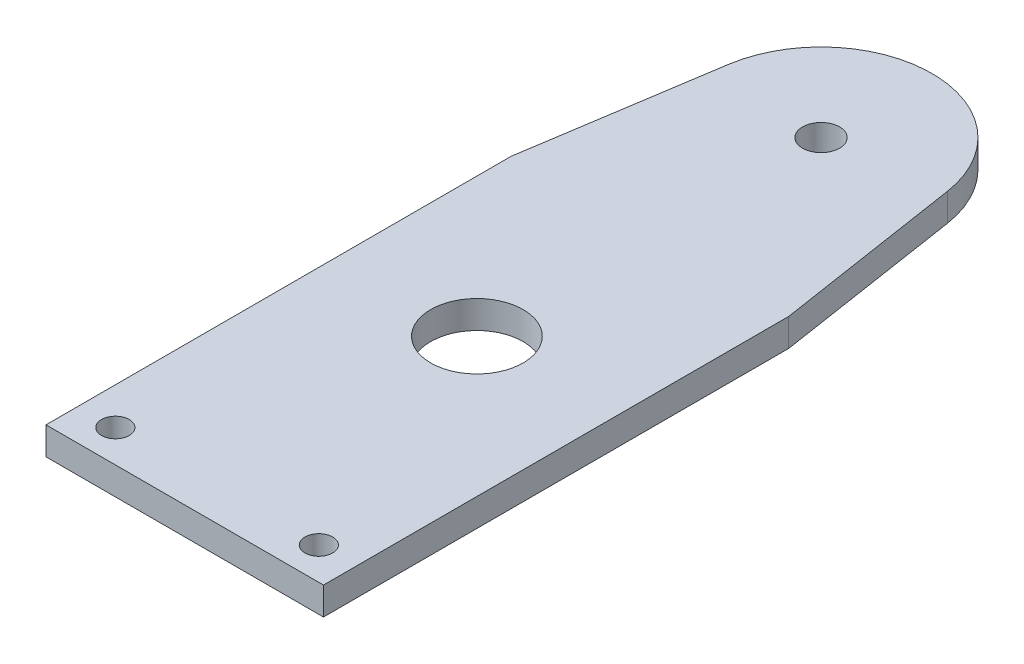
ISO-10303-21;
HEADER;
FILE_DESCRIPTION(('STEP AP214'),'2;1');
FILE_NAME('part.step','',(''),(''),'','','');
FILE_SCHEMA(('AUTOMOTIVE_DESIGN { 1 0 10303 214 1 1 1 1 }'));
ENDSEC;
DATA;
#1=APPLICATION_CONTEXT('core data for automotive mechanical design processes');
#2=APPLICATION_PROTOCOL_DEFINITION('international standard','automotive_design',2000,#1);
#3=PRODUCT_CONTEXT('',#1,'mechanical');
#4=PRODUCT('Part','Part','',(#3));
#5=PRODUCT_RELATED_PRODUCT_CATEGORY('part','',(#4));
#6=PRODUCT_DEFINITION_FORMATION('','',#4);
#7=PRODUCT_DEFINITION_CONTEXT('part definition',#1,'design');
#8=PRODUCT_DEFINITION('design','',#6,#7);
#9=PRODUCT_DEFINITION_SHAPE('','',#8);
#10=(LENGTH_UNIT() NAMED_UNIT(*) SI_UNIT(.MILLI.,.METRE.));
#11=(NAMED_UNIT(*) PLANE_ANGLE_UNIT() SI_UNIT($,.RADIAN.));
#12=(NAMED_UNIT(*) SI_UNIT($,.STERADIAN.) SOLID_ANGLE_UNIT());
#13=UNCERTAINTY_MEASURE_WITH_UNIT(LENGTH_MEASURE(1.E-05),#10,'distance_accuracy_value','');
#14=(GEOMETRIC_REPRESENTATION_CONTEXT(3) GLOBAL_UNCERTAINTY_ASSIGNED_CONTEXT((#13)) GLOBAL_UNIT_ASSIGNED_CONTEXT((#10,
#11,#12)) REPRESENTATION_CONTEXT('',''));
#15=CARTESIAN_POINT('',(0.,0.,0.));
#16=DIRECTION('',(0.,0.,1.));
#17=DIRECTION('',(1.,0.,0.));
#18=AXIS2_PLACEMENT_3D('',#15,#16,#17);
#19=CARTESIAN_POINT('',(-2.62522791540278,3.,-39.1827211912994));
#20=DIRECTION('',(0.,1.,0.));
#21=DIRECTION('',(0.,0.,1.));
#22=AXIS2_PLACEMENT_3D('',#19,#20,#21);
#23=PLANE('',#22);
#24=CARTESIAN_POINT('',(-2.62522791540278,3.,-39.1827211912994));
#25=DIRECTION('',(0.,1.,0.));
#26=DIRECTION('',(0.,0.,1.));
#27=AXIS2_PLACEMENT_3D('',#24,#25,#26);
#28=CIRCLE('',#27,2.);
#29=CARTESIAN_POINT('',(-2.62522791540278,3.,-37.1827211912994));
#30=VERTEX_POINT('',#29);
#31=EDGE_CURVE('E188',#30,#30,#28,.T.);
#32=ORIENTED_EDGE('',*,*,#31,.F.);
#33=EDGE_LOOP('',(#32));
#34=FACE_BOUND('',#33,.T.);
#35=CARTESIAN_POINT('',(-13.6252279154028,3.,26.1172788087006));
#36=DIRECTION('',(0.,1.,0.));
#37=DIRECTION('',(0.,0.,1.));
#38=AXIS2_PLACEMENT_3D('',#35,#36,#37);
#39=CIRCLE('',#38,1.5);
#40=CARTESIAN_POINT('',(-13.6252279154028,3.,27.6172788087006));
#41=VERTEX_POINT('',#40);
#42=EDGE_CURVE('E121',#41,#41,#39,.T.);
#43=ORIENTED_EDGE('',*,*,#42,.F.);
#44=EDGE_LOOP('',(#43));
#45=FACE_BOUND('',#44,.T.);
#46=DIRECTION('',(0.,0.,1.));
#47=VECTOR('',#46,1.);
#48=CARTESIAN_POINT('',(-17.6252279154028,3.,29.6172788087006));
#49=LINE('',#48,#47);
#50=CARTESIAN_POINT('',(-17.6252279154028,3.,-20.6827211912994));
#51=VERTEX_POINT('',#50);
#52=CARTESIAN_POINT('',(-17.6252279154028,3.,29.6172788087006));
#53=VERTEX_POINT('',#52);
#54=EDGE_CURVE('E128',#51,#53,#49,.T.);
#55=ORIENTED_EDGE('',*,*,#54,.T.);
#56=DIRECTION('',(1.,0.,0.));
#57=VECTOR('',#56,1.);
#58=CARTESIAN_POINT('',(-10.6252279154028,3.,29.6172788087006));
#59=LINE('',#58,#57);
#60=CARTESIAN_POINT('',(12.3747720845972,3.,29.6172788087006));
#61=VERTEX_POINT('',#60);
#62=EDGE_CURVE('E86',#53,#61,#59,.T.);
#63=ORIENTED_EDGE('',*,*,#62,.T.);
#64=DIRECTION('',(0.,0.,-1.));
#65=VECTOR('',#64,1.);
#66=CARTESIAN_POINT('',(12.3747720845972,3.,29.6172788087006));
#67=LINE('',#66,#65);
#68=CARTESIAN_POINT('',(12.3747720845972,3.,-20.6827211912994));
#69=VERTEX_POINT('',#68);
#70=EDGE_CURVE('E99',#61,#69,#67,.T.);
#71=ORIENTED_EDGE('',*,*,#70,.T.);
#72=DIRECTION('',(-0.152658632299012,0.,-0.988278979835449));
#73=VECTOR('',#72,1.);
#74=CARTESIAN_POINT('',(12.3747720845972,3.,-20.6827211912994));
#75=LINE('',#74,#73);
#76=CARTESIAN_POINT('',(9.23411984262261,3.,-41.0146247788876));
#77=VERTEX_POINT('',#76);
#78=EDGE_CURVE('E93',#69,#77,#75,.T.);
#79=ORIENTED_EDGE('',*,*,#78,.T.);
#80=CARTESIAN_POINT('',(-2.62522791540278,3.,-39.1827211912994));
#81=DIRECTION('',(0.,1.,0.));
#82=DIRECTION('',(0.,0.,1.));
#83=AXIS2_PLACEMENT_3D('',#80,#81,#82);
#84=CIRCLE('',#83,12.);
#85=CARTESIAN_POINT('',(-14.4845756734282,3.,-41.0146247788876));
#86=VERTEX_POINT('',#85);
#87=EDGE_CURVE('E97',#77,#86,#84,.T.);
#88=ORIENTED_EDGE('',*,*,#87,.T.);
#89=DIRECTION('',(-0.152658632299012,0.,0.988278979835449));
#90=VECTOR('',#89,1.);
#91=CARTESIAN_POINT('',(-17.6252279154028,3.,-20.6827211912994));
#92=LINE('',#91,#90);
#93=EDGE_CURVE('E49',#86,#51,#92,.T.);
#94=ORIENTED_EDGE('',*,*,#93,.T.);
#95=EDGE_LOOP('',(#55,#63,#71,#79,#88,#94));
#96=FACE_BOUND('',#95,.T.);
#97=CARTESIAN_POINT('',(8.37477208459722,3.,26.1172788087006));
#98=DIRECTION('',(0.,1.,0.));
#99=DIRECTION('',(0.,0.,1.));
#100=AXIS2_PLACEMENT_3D('',#97,#98,#99);
#101=CIRCLE('',#100,1.5);
#102=CARTESIAN_POINT('',(8.37477208459722,3.,27.6172788087006));
#103=VERTEX_POINT('',#102);
#104=EDGE_CURVE('E194',#103,#103,#101,.T.);
#105=ORIENTED_EDGE('',*,*,#104,.F.);
#106=EDGE_LOOP('',(#105));
#107=FACE_BOUND('',#106,.T.);
#108=CARTESIAN_POINT('',(-2.62522791540278,3.,-1.97272119129942));
#109=DIRECTION('',(0.,1.,0.));
#110=DIRECTION('',(0.,0.,1.));
#111=AXIS2_PLACEMENT_3D('',#108,#109,#110);
#112=CIRCLE('',#111,5.);
#113=CARTESIAN_POINT('',(-2.62522791540278,3.,3.02727880870058));
#114=VERTEX_POINT('',#113);
#115=EDGE_CURVE('E179',#114,#114,#112,.T.);
#116=ORIENTED_EDGE('',*,*,#115,.F.);
#117=EDGE_LOOP('',(#116));
#118=FACE_BOUND('',#117,.T.);
#119=ADVANCED_FACE('F32',(#34,#45,#96,#107,#118),#23,.T.);
#120=CARTESIAN_POINT('',(-2.62522791540278,0.,-39.1827211912994));
#121=DIRECTION('',(0.,1.,0.));
#122=DIRECTION('',(0.,0.,1.));
#123=AXIS2_PLACEMENT_3D('',#120,#121,#122);
#124=PLANE('',#123);
#125=DIRECTION('',(0.,0.,1.));
#126=VECTOR('',#125,1.);
#127=CARTESIAN_POINT('',(-17.6252279154028,0.,29.6172788087006));
#128=LINE('',#127,#126);
#129=CARTESIAN_POINT('',(-17.6252279154028,0.,-20.6827211912994));
#130=VERTEX_POINT('',#129);
#131=CARTESIAN_POINT('',(-17.6252279154028,0.,29.6172788087006));
#132=VERTEX_POINT('',#131);
#133=EDGE_CURVE('E117',#130,#132,#128,.T.);
#134=ORIENTED_EDGE('',*,*,#133,.F.);
#135=DIRECTION('',(-0.152658632299012,0.,0.988278979835449));
#136=VECTOR('',#135,1.);
#137=CARTESIAN_POINT('',(-17.6252279154028,0.,-20.6827211912994));
#138=LINE('',#137,#136);
#139=CARTESIAN_POINT('',(-14.4845756734282,0.,-41.0146247788876));
#140=VERTEX_POINT('',#139);
#141=EDGE_CURVE('E78',#140,#130,#138,.T.);
#142=ORIENTED_EDGE('',*,*,#141,.F.);
#143=CARTESIAN_POINT('',(-2.62522791540278,0.,-39.1827211912994));
#144=DIRECTION('',(0.,1.,0.));
#145=DIRECTION('',(0.,0.,1.));
#146=AXIS2_PLACEMENT_3D('',#143,#144,#145);
#147=CIRCLE('',#146,12.);
#148=CARTESIAN_POINT('',(9.23411984262261,0.,-41.0146247788876));
#149=VERTEX_POINT('',#148);
#150=EDGE_CURVE('E72',#149,#140,#147,.T.);
#151=ORIENTED_EDGE('',*,*,#150,.F.);
#152=DIRECTION('',(-0.152658632299012,0.,-0.988278979835449));
#153=VECTOR('',#152,1.);
#154=CARTESIAN_POINT('',(12.3747720845972,0.,-20.6827211912994));
#155=LINE('',#154,#153);
#156=CARTESIAN_POINT('',(12.3747720845972,0.,-20.6827211912994));
#157=VERTEX_POINT('',#156);
#158=EDGE_CURVE('E107',#157,#149,#155,.T.);
#159=ORIENTED_EDGE('',*,*,#158,.F.);
#160=DIRECTION('',(0.,0.,-1.));
#161=VECTOR('',#160,1.);
#162=CARTESIAN_POINT('',(12.3747720845972,0.,29.6172788087006));
#163=LINE('',#162,#161);
#164=CARTESIAN_POINT('',(12.3747720845972,0.,29.6172788087006));
#165=VERTEX_POINT('',#164);
#166=EDGE_CURVE('E123',#165,#157,#163,.T.);
#167=ORIENTED_EDGE('',*,*,#166,.F.);
#168=DIRECTION('',(1.,0.,0.));
#169=VECTOR('',#168,1.);
#170=CARTESIAN_POINT('',(5.37477208459723,0.,29.6172788087006));
#171=LINE('',#170,#169);
#172=EDGE_CURVE('E120',#132,#165,#171,.T.);
#173=ORIENTED_EDGE('',*,*,#172,.F.);
#174=EDGE_LOOP('',(#134,#142,#151,#159,#167,#173));
#175=FACE_BOUND('',#174,.T.);
#176=CARTESIAN_POINT('',(-13.6252279154028,0.,26.1172788087006));
#177=DIRECTION('',(0.,1.,0.));
#178=DIRECTION('',(0.,0.,1.));
#179=AXIS2_PLACEMENT_3D('',#176,#177,#178);
#180=CIRCLE('',#179,1.5);
#181=CARTESIAN_POINT('',(-13.6252279154028,0.,27.6172788087006));
#182=VERTEX_POINT('',#181);
#183=EDGE_CURVE('E197',#182,#182,#180,.T.);
#184=ORIENTED_EDGE('',*,*,#183,.T.);
#185=EDGE_LOOP('',(#184));
#186=FACE_BOUND('',#185,.T.);
#187=CARTESIAN_POINT('',(8.37477208459722,0.,26.1172788087006));
#188=DIRECTION('',(0.,1.,0.));
#189=DIRECTION('',(0.,0.,1.));
#190=AXIS2_PLACEMENT_3D('',#187,#188,#189);
#191=CIRCLE('',#190,1.5);
#192=CARTESIAN_POINT('',(8.37477208459722,0.,27.6172788087006));
#193=VERTEX_POINT('',#192);
#194=EDGE_CURVE('E191',#193,#193,#191,.T.);
#195=ORIENTED_EDGE('',*,*,#194,.T.);
#196=EDGE_LOOP('',(#195));
#197=FACE_BOUND('',#196,.T.);
#198=CARTESIAN_POINT('',(-2.62522791540278,0.,-39.1827211912994));
#199=DIRECTION('',(0.,1.,0.));
#200=DIRECTION('',(0.,0.,1.));
#201=AXIS2_PLACEMENT_3D('',#198,#199,#200);
#202=CIRCLE('',#201,2.);
#203=CARTESIAN_POINT('',(-2.62522791540278,0.,-37.1827211912994));
#204=VERTEX_POINT('',#203);
#205=EDGE_CURVE('E185',#204,#204,#202,.T.);
#206=ORIENTED_EDGE('',*,*,#205,.T.);
#207=EDGE_LOOP('',(#206));
#208=FACE_BOUND('',#207,.T.);
#209=CARTESIAN_POINT('',(-2.62522791540278,0.,-1.97272119129942));
#210=DIRECTION('',(0.,1.,0.));
#211=DIRECTION('',(0.,0.,1.));
#212=AXIS2_PLACEMENT_3D('',#209,#210,#211);
#213=CIRCLE('',#212,5.);
#214=CARTESIAN_POINT('',(-2.62522791540278,0.,3.02727880870058));
#215=VERTEX_POINT('',#214);
#216=EDGE_CURVE('E182',#215,#215,#213,.T.);
#217=ORIENTED_EDGE('',*,*,#216,.T.);
#218=EDGE_LOOP('',(#217));
#219=FACE_BOUND('',#218,.T.);
#220=ADVANCED_FACE('F137',(#175,#186,#197,#208,#219),#124,.F.);
#221=CARTESIAN_POINT('',(-17.6252279154028,3.,29.6172788087006));
#222=DIRECTION('',(1.,0.,0.));
#223=DIRECTION('',(0.,0.,-1.));
#224=AXIS2_PLACEMENT_3D('',#221,#222,#223);
#225=PLANE('',#224);
#226=ORIENTED_EDGE('',*,*,#133,.T.);
#227=DIRECTION('',(0.,-1.,0.));
#228=VECTOR('',#227,1.);
#229=CARTESIAN_POINT('',(-17.6252279154028,3.,29.6172788087006));
#230=LINE('',#229,#228);
#231=EDGE_CURVE('E11',#53,#132,#230,.T.);
#232=ORIENTED_EDGE('',*,*,#231,.F.);
#233=ORIENTED_EDGE('',*,*,#54,.F.);
#234=DIRECTION('',(0.,-1.,0.));
#235=VECTOR('',#234,1.);
#236=CARTESIAN_POINT('',(-17.6252279154028,3.,-20.6827211912994));
#237=LINE('',#236,#235);
#238=EDGE_CURVE('E113',#51,#130,#237,.T.);
#239=ORIENTED_EDGE('',*,*,#238,.T.);
#240=EDGE_LOOP('',(#226,#232,#233,#239));
#241=FACE_BOUND('',#240,.T.);
#242=ADVANCED_FACE('F34',(#241),#225,.F.);
#243=CARTESIAN_POINT('',(5.37477208459723,3.,29.6172788087006));
#244=DIRECTION('',(0.,0.,-1.));
#245=DIRECTION('',(-1.,0.,0.));
#246=AXIS2_PLACEMENT_3D('',#243,#244,#245);
#247=PLANE('',#246);
#248=ORIENTED_EDGE('',*,*,#172,.T.);
#249=DIRECTION('',(0.,-1.,0.));
#250=VECTOR('',#249,1.);
#251=CARTESIAN_POINT('',(12.3747720845972,3.,29.6172788087006));
#252=LINE('',#251,#250);
#253=EDGE_CURVE('E41',#61,#165,#252,.T.);
#254=ORIENTED_EDGE('',*,*,#253,.F.);
#255=ORIENTED_EDGE('',*,*,#62,.F.);
#256=ORIENTED_EDGE('',*,*,#231,.T.);
#257=EDGE_LOOP('',(#248,#254,#255,#256));
#258=FACE_BOUND('',#257,.T.);
#259=ADVANCED_FACE('F255',(#258),#247,.F.);
#260=CARTESIAN_POINT('',(12.3747720845972,3.,29.6172788087006));
#261=DIRECTION('',(-1.,0.,0.));
#262=DIRECTION('',(0.,0.,1.));
#263=AXIS2_PLACEMENT_3D('',#260,#261,#262);
#264=PLANE('',#263);
#265=ORIENTED_EDGE('',*,*,#166,.T.);
#266=DIRECTION('',(0.,-1.,0.));
#267=VECTOR('',#266,1.);
#268=CARTESIAN_POINT('',(12.3747720845972,3.,-20.6827211912994));
#269=LINE('',#268,#267);
#270=EDGE_CURVE('E108',#69,#157,#269,.T.);
#271=ORIENTED_EDGE('',*,*,#270,.F.);
#272=ORIENTED_EDGE('',*,*,#70,.F.);
#273=ORIENTED_EDGE('',*,*,#253,.T.);
#274=EDGE_LOOP('',(#265,#271,#272,#273));
#275=FACE_BOUND('',#274,.T.);
#276=ADVANCED_FACE('F134',(#275),#264,.F.);
#277=CARTESIAN_POINT('',(12.3747720845972,3.,-20.6827211912994));
#278=DIRECTION('',(-0.988278979835449,0.,0.152658632299012));
#279=DIRECTION('',(0.152658632299012,0.,0.988278979835449));
#280=AXIS2_PLACEMENT_3D('',#277,#278,#279);
#281=PLANE('',#280);
#282=ORIENTED_EDGE('',*,*,#158,.T.);
#283=DIRECTION('',(0.,-1.,0.));
#284=VECTOR('',#283,1.);
#285=CARTESIAN_POINT('',(9.23411984262261,3.,-41.0146247788876));
#286=LINE('',#285,#284);
#287=EDGE_CURVE('E104',#77,#149,#286,.T.);
#288=ORIENTED_EDGE('',*,*,#287,.F.);
#289=ORIENTED_EDGE('',*,*,#78,.F.);
#290=ORIENTED_EDGE('',*,*,#270,.T.);
#291=EDGE_LOOP('',(#282,#288,#289,#290));
#292=FACE_BOUND('',#291,.T.);
#293=ADVANCED_FACE('F105',(#292),#281,.F.);
#294=CARTESIAN_POINT('',(-2.62522791540278,3.,-39.1827211912994));
#295=DIRECTION('',(0.,-1.,0.));
#296=DIRECTION('',(0.,0.,-1.));
#297=AXIS2_PLACEMENT_3D('',#294,#295,#296);
#298=CYLINDRICAL_SURFACE('',#297,12.);
#299=ORIENTED_EDGE('',*,*,#150,.T.);
#300=DIRECTION('',(0.,-1.,0.));
#301=VECTOR('',#300,1.);
#302=CARTESIAN_POINT('',(-14.4845756734282,3.,-41.0146247788876));
#303=LINE('',#302,#301);
#304=EDGE_CURVE('E109',#86,#140,#303,.T.);
#305=ORIENTED_EDGE('',*,*,#304,.F.);
#306=ORIENTED_EDGE('',*,*,#87,.F.);
#307=ORIENTED_EDGE('',*,*,#287,.T.);
#308=EDGE_LOOP('',(#299,#305,#306,#307));
#309=FACE_BOUND('',#308,.T.);
#310=ADVANCED_FACE('F111',(#309),#298,.T.);
#311=CARTESIAN_POINT('',(-17.6252279154028,3.,-20.6827211912994));
#312=DIRECTION('',(0.988278979835449,0.,0.152658632299012));
#313=DIRECTION('',(0.152658632299012,0.,-0.988278979835449));
#314=AXIS2_PLACEMENT_3D('',#311,#312,#313);
#315=PLANE('',#314);
#316=ORIENTED_EDGE('',*,*,#141,.T.);
#317=ORIENTED_EDGE('',*,*,#238,.F.);
#318=ORIENTED_EDGE('',*,*,#93,.F.);
#319=ORIENTED_EDGE('',*,*,#304,.T.);
#320=EDGE_LOOP('',(#316,#317,#318,#319));
#321=FACE_BOUND('',#320,.T.);
#322=ADVANCED_FACE('F142',(#321),#315,.F.);
#323=CARTESIAN_POINT('',(-13.6252279154028,3.,26.1172788087006));
#324=DIRECTION('',(0.,-1.,0.));
#325=DIRECTION('',(0.,0.,-1.));
#326=AXIS2_PLACEMENT_3D('',#323,#324,#325);
#327=CYLINDRICAL_SURFACE('',#326,1.5);
#328=ORIENTED_EDGE('',*,*,#42,.T.);
#329=EDGE_LOOP('',(#328));
#330=FACE_BOUND('',#329,.T.);
#331=ORIENTED_EDGE('',*,*,#183,.F.);
#332=EDGE_LOOP('',(#331));
#333=FACE_BOUND('',#332,.T.);
#334=ADVANCED_FACE('F144',(#330,#333),#327,.F.);
#335=CARTESIAN_POINT('',(8.37477208459722,3.,26.1172788087006));
#336=DIRECTION('',(0.,-1.,0.));
#337=DIRECTION('',(0.,0.,-1.));
#338=AXIS2_PLACEMENT_3D('',#335,#336,#337);
#339=CYLINDRICAL_SURFACE('',#338,1.5);
#340=ORIENTED_EDGE('',*,*,#104,.T.);
#341=EDGE_LOOP('',(#340));
#342=FACE_BOUND('',#341,.T.);
#343=ORIENTED_EDGE('',*,*,#194,.F.);
#344=EDGE_LOOP('',(#343));
#345=FACE_BOUND('',#344,.T.);
#346=ADVANCED_FACE('F150',(#342,#345),#339,.F.);
#347=CARTESIAN_POINT('',(-2.62522791540278,3.,-39.1827211912994));
#348=DIRECTION('',(0.,-1.,0.));
#349=DIRECTION('',(0.,0.,-1.));
#350=AXIS2_PLACEMENT_3D('',#347,#348,#349);
#351=CYLINDRICAL_SURFACE('',#350,2.);
#352=ORIENTED_EDGE('',*,*,#31,.T.);
#353=EDGE_LOOP('',(#352));
#354=FACE_BOUND('',#353,.T.);
#355=ORIENTED_EDGE('',*,*,#205,.F.);
#356=EDGE_LOOP('',(#355));
#357=FACE_BOUND('',#356,.T.);
#358=ADVANCED_FACE('F166',(#354,#357),#351,.F.);
#359=CARTESIAN_POINT('',(-2.62522791540278,3.,-1.97272119129942));
#360=DIRECTION('',(0.,-1.,0.));
#361=DIRECTION('',(0.,0.,-1.));
#362=AXIS2_PLACEMENT_3D('',#359,#360,#361);
#363=CYLINDRICAL_SURFACE('',#362,5.);
#364=ORIENTED_EDGE('',*,*,#115,.T.);
#365=EDGE_LOOP('',(#364));
#366=FACE_BOUND('',#365,.T.);
#367=ORIENTED_EDGE('',*,*,#216,.F.);
#368=EDGE_LOOP('',(#367));
#369=FACE_BOUND('',#368,.T.);
#370=ADVANCED_FACE('F170',(#366,#369),#363,.F.);
#371=CLOSED_SHELL('',(#119,#220,#242,#259,#276,#293,#310,#322,#334,#346,#358,#370));
#372=MANIFOLD_SOLID_BREP('B2',#371);
#373=ADVANCED_BREP_SHAPE_REPRESENTATION('',(#18,#372),#14);
#374=SHAPE_DEFINITION_REPRESENTATION(#9,#373);
ENDSEC;
END-ISO-10303-21;
